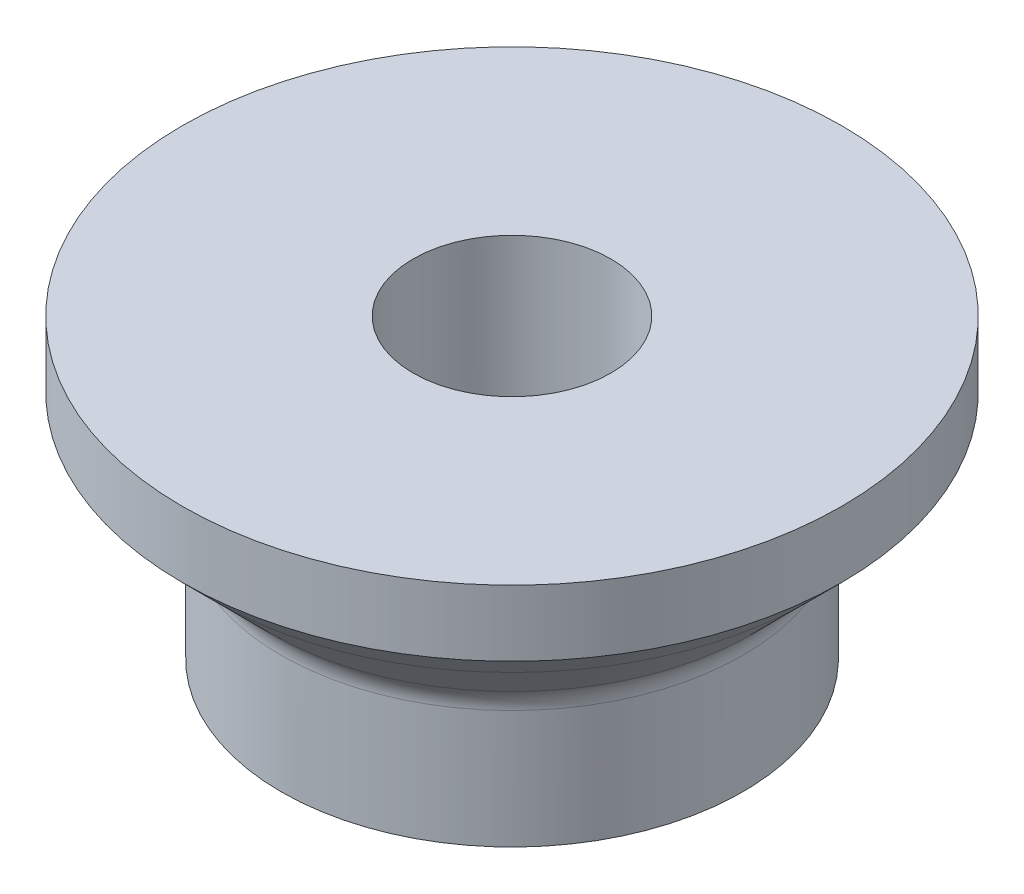
ISO-10303-21;
HEADER;
FILE_DESCRIPTION(('STEP AP214'),'2;1');
FILE_NAME('part.step','',(''),(''),'','','');
FILE_SCHEMA(('AUTOMOTIVE_DESIGN { 1 0 10303 214 1 1 1 1 }'));
ENDSEC;
DATA;
#1=APPLICATION_CONTEXT('core data for automotive mechanical design processes');
#2=APPLICATION_PROTOCOL_DEFINITION('international standard','automotive_design',2000,#1);
#3=PRODUCT_CONTEXT('',#1,'mechanical');
#4=PRODUCT('Part','Part','',(#3));
#5=PRODUCT_RELATED_PRODUCT_CATEGORY('part','',(#4));
#6=PRODUCT_DEFINITION_FORMATION('','',#4);
#7=PRODUCT_DEFINITION_CONTEXT('part definition',#1,'design');
#8=PRODUCT_DEFINITION('design','',#6,#7);
#9=PRODUCT_DEFINITION_SHAPE('','',#8);
#10=(LENGTH_UNIT() NAMED_UNIT(*) SI_UNIT(.MILLI.,.METRE.));
#11=(NAMED_UNIT(*) PLANE_ANGLE_UNIT() SI_UNIT($,.RADIAN.));
#12=(NAMED_UNIT(*) SI_UNIT($,.STERADIAN.) SOLID_ANGLE_UNIT());
#13=UNCERTAINTY_MEASURE_WITH_UNIT(LENGTH_MEASURE(1.E-05),#10,'distance_accuracy_value','');
#14=(GEOMETRIC_REPRESENTATION_CONTEXT(3) GLOBAL_UNCERTAINTY_ASSIGNED_CONTEXT((#13)) GLOBAL_UNIT_ASSIGNED_CONTEXT((#10,
#11,#12)) REPRESENTATION_CONTEXT('',''));
#15=CARTESIAN_POINT('',(0.,0.,0.));
#16=DIRECTION('',(0.,0.,1.));
#17=DIRECTION('',(1.,0.,0.));
#18=AXIS2_PLACEMENT_3D('',#15,#16,#17);
#19=CARTESIAN_POINT('',(0.,9.,0.));
#20=DIRECTION('',(0.,-1.,0.));
#21=DIRECTION('',(0.,0.,-1.));
#22=AXIS2_PLACEMENT_3D('',#19,#20,#21);
#23=CYLINDRICAL_SURFACE('',#22,3.);
#24=CARTESIAN_POINT('',(0.,9.,0.));
#25=DIRECTION('',(0.,1.,0.));
#26=DIRECTION('',(0.,0.,1.));
#27=AXIS2_PLACEMENT_3D('',#24,#25,#26);
#28=CIRCLE('',#27,3.);
#29=CARTESIAN_POINT('',(0.,9.,3.));
#30=VERTEX_POINT('',#29);
#31=EDGE_CURVE('E150',#30,#30,#28,.T.);
#32=ORIENTED_EDGE('',*,*,#31,.T.);
#33=EDGE_LOOP('',(#32));
#34=FACE_BOUND('',#33,.T.);
#35=CARTESIAN_POINT('',(0.,3.,0.));
#36=DIRECTION('',(0.,-1.,0.));
#37=DIRECTION('',(0.,0.,-1.));
#38=AXIS2_PLACEMENT_3D('',#35,#36,#37);
#39=CIRCLE('',#38,3.);
#40=CARTESIAN_POINT('',(0.,3.,-3.));
#41=VERTEX_POINT('',#40);
#42=EDGE_CURVE('E141',#41,#41,#39,.T.);
#43=ORIENTED_EDGE('',*,*,#42,.T.);
#44=EDGE_LOOP('',(#43));
#45=FACE_BOUND('',#44,.T.);
#46=ADVANCED_FACE('F39',(#34,#45),#23,.F.);
#47=CARTESIAN_POINT('',(0.,9.,0.));
#48=DIRECTION('',(0.,-1.,0.));
#49=DIRECTION('',(0.,0.,-1.));
#50=AXIS2_PLACEMENT_3D('',#47,#48,#49);
#51=CYLINDRICAL_SURFACE('',#50,7.);
#52=CARTESIAN_POINT('',(0.,3.58578643762691,0.));
#53=DIRECTION('',(0.,-1.,0.));
#54=DIRECTION('',(0.,0.,-1.));
#55=AXIS2_PLACEMENT_3D('',#52,#53,#54);
#56=CIRCLE('',#55,7.);
#57=CARTESIAN_POINT('',(0.,3.58578643762691,-7.));
#58=VERTEX_POINT('',#57);
#59=EDGE_CURVE('E47',#58,#58,#56,.T.);
#60=ORIENTED_EDGE('',*,*,#59,.T.);
#61=EDGE_LOOP('',(#60));
#62=FACE_BOUND('',#61,.T.);
#63=CARTESIAN_POINT('',(0.,0.,0.));
#64=DIRECTION('',(0.,1.,0.));
#65=DIRECTION('',(0.,0.,1.));
#66=AXIS2_PLACEMENT_3D('',#63,#64,#65);
#67=CIRCLE('',#66,7.);
#68=CARTESIAN_POINT('',(0.,0.,7.));
#69=VERTEX_POINT('',#68);
#70=EDGE_CURVE('E153',#69,#69,#67,.T.);
#71=ORIENTED_EDGE('',*,*,#70,.T.);
#72=EDGE_LOOP('',(#71));
#73=FACE_BOUND('',#72,.T.);
#74=ADVANCED_FACE('F166',(#62,#73),#51,.T.);
#75=CARTESIAN_POINT('',(0.,9.,0.));
#76=DIRECTION('',(0.,1.,0.));
#77=DIRECTION('',(0.,0.,1.));
#78=AXIS2_PLACEMENT_3D('',#75,#76,#77);
#79=PLANE('',#78);
#80=ORIENTED_EDGE('',*,*,#31,.F.);
#81=EDGE_LOOP('',(#80));
#82=FACE_BOUND('',#81,.T.);
#83=CARTESIAN_POINT('',(0.,9.,0.));
#84=DIRECTION('',(0.,1.,0.));
#85=DIRECTION('',(0.,0.,1.));
#86=AXIS2_PLACEMENT_3D('',#83,#84,#85);
#87=CIRCLE('',#86,10.);
#88=CARTESIAN_POINT('',(0.,9.,10.));
#89=VERTEX_POINT('',#88);
#90=EDGE_CURVE('E147',#89,#89,#87,.T.);
#91=ORIENTED_EDGE('',*,*,#90,.T.);
#92=EDGE_LOOP('',(#91));
#93=FACE_BOUND('',#92,.T.);
#94=ADVANCED_FACE('F184',(#82,#93),#79,.T.);
#95=CARTESIAN_POINT('',(0.,0.,0.));
#96=DIRECTION('',(0.,1.,0.));
#97=DIRECTION('',(0.,0.,1.));
#98=AXIS2_PLACEMENT_3D('',#95,#96,#97);
#99=PLANE('',#98);
#100=DIRECTION('',(0.909017894331307,0.,-0.416757084865364));
#101=VECTOR('',#100,1.);
#102=CARTESIAN_POINT('',(-4.00170994613686,0.,-2.84071308658982));
#103=LINE('',#102,#101);
#104=CARTESIAN_POINT('',(-4.00170994613686,0.,-2.84071308658983));
#105=VERTEX_POINT('',#104);
#106=CARTESIAN_POINT('',(0.459274724781263,0.,-4.88593901522629));
#107=VERTEX_POINT('',#106);
#108=EDGE_CURVE('E128',#105,#107,#103,.T.);
#109=ORIENTED_EDGE('',*,*,#108,.F.);
#110=DIRECTION('',(0.0935867244651015,0.,-0.995611131418233));
#111=VECTOR('',#110,1.);
#112=CARTESIAN_POINT('',(-4.46098467091812,0.,2.04522592863646));
#113=LINE('',#112,#111);
#114=CARTESIAN_POINT('',(-4.46098467091812,0.,2.04522592863646));
#115=VERTEX_POINT('',#114);
#116=EDGE_CURVE('E54',#115,#105,#113,.T.);
#117=ORIENTED_EDGE('',*,*,#116,.F.);
#118=DIRECTION('',(-0.815431169866206,0.,-0.578854046552869));
#119=VECTOR('',#118,1.);
#120=CARTESIAN_POINT('',(-0.459274724781265,0.,4.88593901522629));
#121=LINE('',#120,#119);
#122=CARTESIAN_POINT('',(-0.459274724781265,0.,4.88593901522629));
#123=VERTEX_POINT('',#122);
#124=EDGE_CURVE('E137',#123,#115,#121,.T.);
#125=ORIENTED_EDGE('',*,*,#124,.F.);
#126=DIRECTION('',(-0.909017894331307,0.,0.416757084865364));
#127=VECTOR('',#126,1.);
#128=CARTESIAN_POINT('',(4.00170994613686,0.,2.84071308658983));
#129=LINE('',#128,#127);
#130=CARTESIAN_POINT('',(4.00170994613686,0.,2.84071308658983));
#131=VERTEX_POINT('',#130);
#132=EDGE_CURVE('E135',#131,#123,#129,.T.);
#133=ORIENTED_EDGE('',*,*,#132,.F.);
#134=DIRECTION('',(-0.0935867244651017,0.,0.995611131418233));
#135=VECTOR('',#134,1.);
#136=CARTESIAN_POINT('',(4.46098467091812,0.,-2.04522592863646));
#137=LINE('',#136,#135);
#138=CARTESIAN_POINT('',(4.46098467091812,0.,-2.04522592863646));
#139=VERTEX_POINT('',#138);
#140=EDGE_CURVE('E102',#139,#131,#137,.T.);
#141=ORIENTED_EDGE('',*,*,#140,.F.);
#142=DIRECTION('',(0.815431169866206,0.,0.578854046552869));
#143=VECTOR('',#142,1.);
#144=CARTESIAN_POINT('',(0.459274724781263,0.,-4.88593901522629));
#145=LINE('',#144,#143);
#146=EDGE_CURVE('E131',#107,#139,#145,.T.);
#147=ORIENTED_EDGE('',*,*,#146,.F.);
#148=EDGE_LOOP('',(#109,#117,#125,#133,#141,#147));
#149=FACE_BOUND('',#148,.T.);
#150=ORIENTED_EDGE('',*,*,#70,.F.);
#151=EDGE_LOOP('',(#150));
#152=FACE_BOUND('',#151,.T.);
#153=ADVANCED_FACE('F193',(#149,#152),#99,.F.);
#154=CARTESIAN_POINT('',(0.,6.,0.));
#155=DIRECTION('',(0.,1.,0.));
#156=DIRECTION('',(0.,0.,1.));
#157=AXIS2_PLACEMENT_3D('',#154,#155,#156);
#158=CYLINDRICAL_SURFACE('',#157,10.);
#159=CARTESIAN_POINT('',(0.,7.,0.));
#160=DIRECTION('',(0.,1.,0.));
#161=DIRECTION('',(0.,0.,1.));
#162=AXIS2_PLACEMENT_3D('',#159,#160,#161);
#163=CIRCLE('',#162,10.);
#164=CARTESIAN_POINT('',(0.,7.,10.));
#165=VERTEX_POINT('',#164);
#166=EDGE_CURVE('E161',#165,#165,#163,.T.);
#167=ORIENTED_EDGE('',*,*,#166,.T.);
#168=EDGE_LOOP('',(#167));
#169=FACE_BOUND('',#168,.T.);
#170=ORIENTED_EDGE('',*,*,#90,.F.);
#171=EDGE_LOOP('',(#170));
#172=FACE_BOUND('',#171,.T.);
#173=ADVANCED_FACE('F189',(#169,#172),#158,.T.);
#174=CARTESIAN_POINT('',(-4.46098467091812,3.,2.04522592863646));
#175=DIRECTION('',(-0.995611131418233,0.,-0.0935867244651015));
#176=DIRECTION('',(-0.0935867244651016,0.,0.995611131418233));
#177=AXIS2_PLACEMENT_3D('',#174,#175,#176);
#178=PLANE('',#177);
#179=ORIENTED_EDGE('',*,*,#116,.T.);
#180=DIRECTION('',(0.,-1.,0.));
#181=VECTOR('',#180,1.);
#182=CARTESIAN_POINT('',(-4.00170994613686,3.,-2.84071308658982));
#183=LINE('',#182,#181);
#184=CARTESIAN_POINT('',(-4.00170994613686,3.,-2.84071308658982));
#185=VERTEX_POINT('',#184);
#186=EDGE_CURVE('E84',#185,#105,#183,.T.);
#187=ORIENTED_EDGE('',*,*,#186,.F.);
#188=DIRECTION('',(0.0935867244651015,0.,-0.995611131418233));
#189=VECTOR('',#188,1.);
#190=CARTESIAN_POINT('',(-4.46098467091812,3.,2.04522592863646));
#191=LINE('',#190,#189);
#192=CARTESIAN_POINT('',(-4.46098467091812,3.,2.04522592863646));
#193=VERTEX_POINT('',#192);
#194=EDGE_CURVE('E139',#193,#185,#191,.T.);
#195=ORIENTED_EDGE('',*,*,#194,.F.);
#196=DIRECTION('',(0.,-1.,0.));
#197=VECTOR('',#196,1.);
#198=CARTESIAN_POINT('',(-4.46098467091812,3.,2.04522592863646));
#199=LINE('',#198,#197);
#200=EDGE_CURVE('E62',#193,#115,#199,.T.);
#201=ORIENTED_EDGE('',*,*,#200,.T.);
#202=EDGE_LOOP('',(#179,#187,#195,#201));
#203=FACE_BOUND('',#202,.T.);
#204=ADVANCED_FACE('F219',(#203),#178,.F.);
#205=CARTESIAN_POINT('',(-0.459274724781265,3.,4.88593901522629));
#206=DIRECTION('',(-0.578854046552869,0.,0.815431169866206));
#207=DIRECTION('',(0.815431169866206,0.,0.578854046552869));
#208=AXIS2_PLACEMENT_3D('',#205,#206,#207);
#209=PLANE('',#208);
#210=ORIENTED_EDGE('',*,*,#124,.T.);
#211=ORIENTED_EDGE('',*,*,#200,.F.);
#212=DIRECTION('',(-0.815431169866206,0.,-0.578854046552869));
#213=VECTOR('',#212,1.);
#214=CARTESIAN_POINT('',(-0.459274724781265,3.,4.88593901522629));
#215=LINE('',#214,#213);
#216=CARTESIAN_POINT('',(-0.459274724781265,3.,4.88593901522629));
#217=VERTEX_POINT('',#216);
#218=EDGE_CURVE('E114',#217,#193,#215,.T.);
#219=ORIENTED_EDGE('',*,*,#218,.F.);
#220=DIRECTION('',(0.,-1.,0.));
#221=VECTOR('',#220,1.);
#222=CARTESIAN_POINT('',(-0.459274724781265,3.,4.88593901522629));
#223=LINE('',#222,#221);
#224=EDGE_CURVE('E106',#217,#123,#223,.T.);
#225=ORIENTED_EDGE('',*,*,#224,.T.);
#226=EDGE_LOOP('',(#210,#211,#219,#225));
#227=FACE_BOUND('',#226,.T.);
#228=ADVANCED_FACE('F225',(#227),#209,.F.);
#229=CARTESIAN_POINT('',(4.00170994613686,3.,2.84071308658983));
#230=DIRECTION('',(0.416757084865364,0.,0.909017894331307));
#231=DIRECTION('',(0.909017894331307,0.,-0.416757084865364));
#232=AXIS2_PLACEMENT_3D('',#229,#230,#231);
#233=PLANE('',#232);
#234=ORIENTED_EDGE('',*,*,#132,.T.);
#235=ORIENTED_EDGE('',*,*,#224,.F.);
#236=DIRECTION('',(-0.909017894331307,0.,0.416757084865364));
#237=VECTOR('',#236,1.);
#238=CARTESIAN_POINT('',(4.00170994613686,3.,2.84071308658983));
#239=LINE('',#238,#237);
#240=CARTESIAN_POINT('',(4.00170994613686,3.,2.84071308658983));
#241=VERTEX_POINT('',#240);
#242=EDGE_CURVE('E110',#241,#217,#239,.T.);
#243=ORIENTED_EDGE('',*,*,#242,.F.);
#244=DIRECTION('',(0.,-1.,0.));
#245=VECTOR('',#244,1.);
#246=CARTESIAN_POINT('',(4.00170994613686,3.,2.84071308658983));
#247=LINE('',#246,#245);
#248=EDGE_CURVE('E95',#241,#131,#247,.T.);
#249=ORIENTED_EDGE('',*,*,#248,.T.);
#250=EDGE_LOOP('',(#234,#235,#243,#249));
#251=FACE_BOUND('',#250,.T.);
#252=ADVANCED_FACE('F111',(#251),#233,.F.);
#253=CARTESIAN_POINT('',(4.46098467091812,3.,-2.04522592863646));
#254=DIRECTION('',(0.995611131418233,0.,0.0935867244651017));
#255=DIRECTION('',(0.0935867244651017,0.,-0.995611131418233));
#256=AXIS2_PLACEMENT_3D('',#253,#254,#255);
#257=PLANE('',#256);
#258=ORIENTED_EDGE('',*,*,#140,.T.);
#259=ORIENTED_EDGE('',*,*,#248,.F.);
#260=DIRECTION('',(-0.0935867244651017,0.,0.995611131418233));
#261=VECTOR('',#260,1.);
#262=CARTESIAN_POINT('',(4.46098467091812,3.,-2.04522592863646));
#263=LINE('',#262,#261);
#264=CARTESIAN_POINT('',(4.46098467091812,3.,-2.04522592863646));
#265=VERTEX_POINT('',#264);
#266=EDGE_CURVE('E99',#265,#241,#263,.T.);
#267=ORIENTED_EDGE('',*,*,#266,.F.);
#268=DIRECTION('',(0.,-1.,0.));
#269=VECTOR('',#268,1.);
#270=CARTESIAN_POINT('',(4.46098467091812,3.,-2.04522592863646));
#271=LINE('',#270,#269);
#272=EDGE_CURVE('E107',#265,#139,#271,.T.);
#273=ORIENTED_EDGE('',*,*,#272,.T.);
#274=EDGE_LOOP('',(#258,#259,#267,#273));
#275=FACE_BOUND('',#274,.T.);
#276=ADVANCED_FACE('F97',(#275),#257,.F.);
#277=CARTESIAN_POINT('',(0.459274724781263,3.,-4.88593901522629));
#278=DIRECTION('',(0.578854046552869,0.,-0.815431169866206));
#279=DIRECTION('',(-0.815431169866206,0.,-0.578854046552869));
#280=AXIS2_PLACEMENT_3D('',#277,#278,#279);
#281=PLANE('',#280);
#282=ORIENTED_EDGE('',*,*,#146,.T.);
#283=ORIENTED_EDGE('',*,*,#272,.F.);
#284=DIRECTION('',(0.815431169866206,0.,0.578854046552869));
#285=VECTOR('',#284,1.);
#286=CARTESIAN_POINT('',(0.459274724781263,3.,-4.88593901522629));
#287=LINE('',#286,#285);
#288=CARTESIAN_POINT('',(0.459274724781263,3.,-4.88593901522629));
#289=VERTEX_POINT('',#288);
#290=EDGE_CURVE('E120',#289,#265,#287,.T.);
#291=ORIENTED_EDGE('',*,*,#290,.F.);
#292=DIRECTION('',(0.,-1.,0.));
#293=VECTOR('',#292,1.);
#294=CARTESIAN_POINT('',(0.459274724781263,3.,-4.88593901522629));
#295=LINE('',#294,#293);
#296=EDGE_CURVE('E144',#289,#107,#295,.T.);
#297=ORIENTED_EDGE('',*,*,#296,.T.);
#298=EDGE_LOOP('',(#282,#283,#291,#297));
#299=FACE_BOUND('',#298,.T.);
#300=ADVANCED_FACE('F233',(#299),#281,.F.);
#301=CARTESIAN_POINT('',(-4.00170994613686,3.,-2.84071308658982));
#302=DIRECTION('',(-0.416757084865364,0.,-0.909017894331307));
#303=DIRECTION('',(-0.909017894331307,0.,0.416757084865364));
#304=AXIS2_PLACEMENT_3D('',#301,#302,#303);
#305=PLANE('',#304);
#306=ORIENTED_EDGE('',*,*,#108,.T.);
#307=ORIENTED_EDGE('',*,*,#296,.F.);
#308=DIRECTION('',(0.909017894331307,0.,-0.416757084865364));
#309=VECTOR('',#308,1.);
#310=CARTESIAN_POINT('',(-4.00170994613686,3.,-2.84071308658982));
#311=LINE('',#310,#309);
#312=EDGE_CURVE('E122',#185,#289,#311,.T.);
#313=ORIENTED_EDGE('',*,*,#312,.F.);
#314=ORIENTED_EDGE('',*,*,#186,.T.);
#315=EDGE_LOOP('',(#306,#307,#313,#314));
#316=FACE_BOUND('',#315,.T.);
#317=ADVANCED_FACE('F209',(#316),#305,.F.);
#318=CARTESIAN_POINT('',(0.,3.,0.));
#319=DIRECTION('',(0.,-1.,0.));
#320=DIRECTION('',(0.,0.,-1.));
#321=AXIS2_PLACEMENT_3D('',#318,#319,#320);
#322=PLANE('',#321);
#323=ORIENTED_EDGE('',*,*,#42,.F.);
#324=EDGE_LOOP('',(#323));
#325=FACE_BOUND('',#324,.T.);
#326=ORIENTED_EDGE('',*,*,#194,.T.);
#327=ORIENTED_EDGE('',*,*,#312,.T.);
#328=ORIENTED_EDGE('',*,*,#290,.T.);
#329=ORIENTED_EDGE('',*,*,#266,.T.);
#330=ORIENTED_EDGE('',*,*,#242,.T.);
#331=ORIENTED_EDGE('',*,*,#218,.T.);
#332=EDGE_LOOP('',(#326,#327,#328,#329,#330,#331));
#333=FACE_BOUND('',#332,.T.);
#334=ADVANCED_FACE('F117',(#325,#333),#322,.T.);
#335=CARTESIAN_POINT('',(0.,6.,0.));
#336=DIRECTION('',(0.,1.,0.));
#337=DIRECTION('',(0.,0.,1.));
#338=AXIS2_PLACEMENT_3D('',#335,#336,#337);
#339=CONICAL_SURFACE('',#338,9.00000000000001,0.785398163397453);
#340=CARTESIAN_POINT('',(0.,4.29289321881346,0.));
#341=DIRECTION('',(0.,1.,0.));
#342=DIRECTION('',(0.,0.,1.));
#343=AXIS2_PLACEMENT_3D('',#340,#341,#342);
#344=CIRCLE('',#343,7.29289321881345);
#345=CARTESIAN_POINT('',(0.,4.29289321881346,7.29289321881345));
#346=VERTEX_POINT('',#345);
#347=EDGE_CURVE('E11',#346,#346,#344,.T.);
#348=ORIENTED_EDGE('',*,*,#347,.T.);
#349=EDGE_LOOP('',(#348));
#350=FACE_BOUND('',#349,.T.);
#351=CARTESIAN_POINT('',(0.,6.,0.));
#352=DIRECTION('',(0.,1.,0.));
#353=DIRECTION('',(0.,0.,1.));
#354=AXIS2_PLACEMENT_3D('',#351,#352,#353);
#355=CIRCLE('',#354,9.00000000000001);
#356=CARTESIAN_POINT('',(0.,6.,9.00000000000001));
#357=VERTEX_POINT('',#356);
#358=EDGE_CURVE('E156',#357,#357,#355,.T.);
#359=ORIENTED_EDGE('',*,*,#358,.F.);
#360=EDGE_LOOP('',(#359));
#361=FACE_BOUND('',#360,.T.);
#362=ADVANCED_FACE('F175',(#350,#361),#339,.T.);
#363=CARTESIAN_POINT('',(0.,7.,0.));
#364=DIRECTION('',(0.,1.,0.));
#365=DIRECTION('',(0.,0.,1.));
#366=AXIS2_PLACEMENT_3D('',#363,#364,#365);
#367=CONICAL_SURFACE('',#366,10.,0.785398163397449);
#368=ORIENTED_EDGE('',*,*,#358,.T.);
#369=EDGE_LOOP('',(#368));
#370=FACE_BOUND('',#369,.T.);
#371=ORIENTED_EDGE('',*,*,#166,.F.);
#372=EDGE_LOOP('',(#371));
#373=FACE_BOUND('',#372,.T.);
#374=ADVANCED_FACE('F170',(#370,#373),#367,.T.);
#375=CARTESIAN_POINT('',(0.,3.58578643762691,0.));
#376=DIRECTION('',(0.,-1.,0.));
#377=DIRECTION('',(0.,0.,-1.));
#378=AXIS2_PLACEMENT_3D('',#375,#376,#377);
#379=TOROIDAL_SURFACE('',#378,8.,1.);
#380=ORIENTED_EDGE('',*,*,#347,.F.);
#381=EDGE_LOOP('',(#380));
#382=FACE_BOUND('',#381,.T.);
#383=ORIENTED_EDGE('',*,*,#59,.F.);
#384=EDGE_LOOP('',(#383));
#385=FACE_BOUND('',#384,.T.);
#386=ADVANCED_FACE('F41',(#382,#385),#379,.F.);
#387=CLOSED_SHELL('',(#46,#74,#94,#153,#173,#204,#228,#252,#276,#300,#317,#334,#362,#374,#386));
#388=MANIFOLD_SOLID_BREP('B2',#387);
#389=ADVANCED_BREP_SHAPE_REPRESENTATION('',(#18,#388),#14);
#390=SHAPE_DEFINITION_REPRESENTATION(#9,#389);
ENDSEC;
END-ISO-10303-21;
